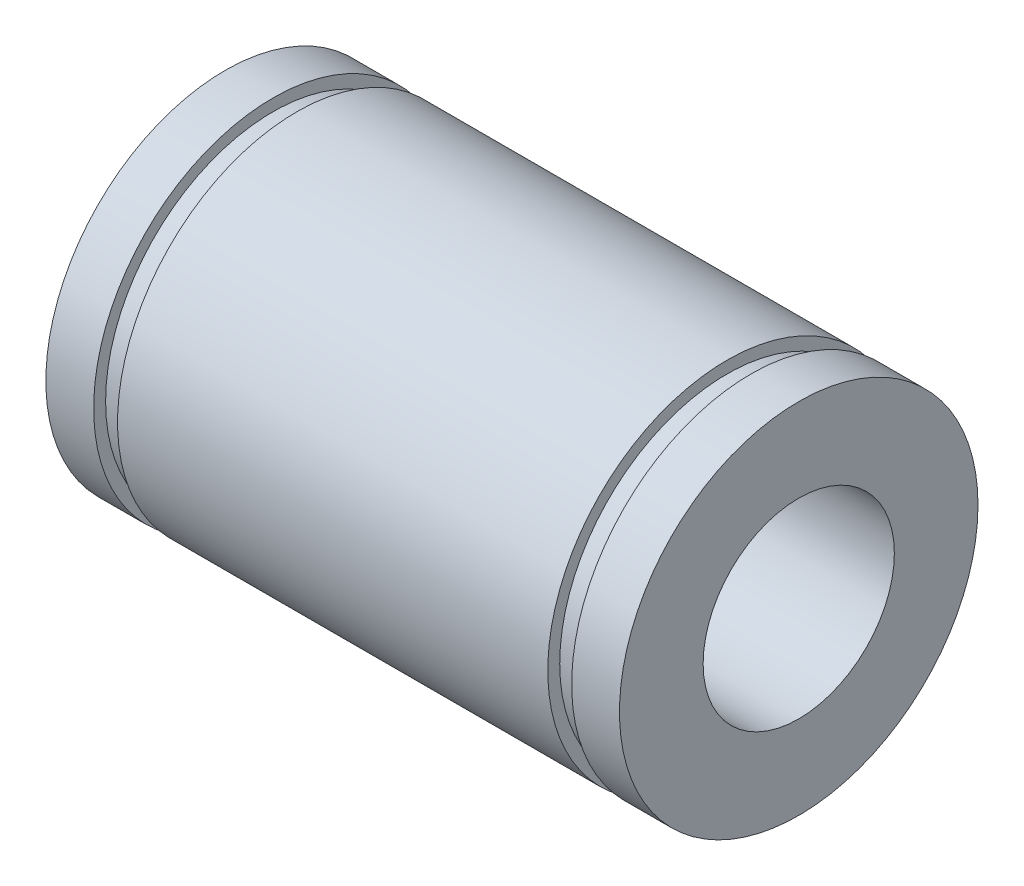
ISO-10303-21;
HEADER;
FILE_DESCRIPTION(('STEP AP214'),'2;1');
FILE_NAME('part.step','',(''),(''),'','','');
FILE_SCHEMA(('AUTOMOTIVE_DESIGN { 1 0 10303 214 1 1 1 1 }'));
ENDSEC;
DATA;
#1=APPLICATION_CONTEXT('core data for automotive mechanical design processes');
#2=APPLICATION_PROTOCOL_DEFINITION('international standard','automotive_design',2000,#1);
#3=PRODUCT_CONTEXT('',#1,'mechanical');
#4=PRODUCT('Part','Part','',(#3));
#5=PRODUCT_RELATED_PRODUCT_CATEGORY('part','',(#4));
#6=PRODUCT_DEFINITION_FORMATION('','',#4);
#7=PRODUCT_DEFINITION_CONTEXT('part definition',#1,'design');
#8=PRODUCT_DEFINITION('design','',#6,#7);
#9=PRODUCT_DEFINITION_SHAPE('','',#8);
#10=(LENGTH_UNIT() NAMED_UNIT(*) SI_UNIT(.MILLI.,.METRE.));
#11=(NAMED_UNIT(*) PLANE_ANGLE_UNIT() SI_UNIT($,.RADIAN.));
#12=(NAMED_UNIT(*) SI_UNIT($,.STERADIAN.) SOLID_ANGLE_UNIT());
#13=UNCERTAINTY_MEASURE_WITH_UNIT(LENGTH_MEASURE(1.E-05),#10,'distance_accuracy_value','');
#14=(GEOMETRIC_REPRESENTATION_CONTEXT(3) GLOBAL_UNCERTAINTY_ASSIGNED_CONTEXT((#13)) GLOBAL_UNIT_ASSIGNED_CONTEXT((#10,
#11,#12)) REPRESENTATION_CONTEXT('',''));
#15=CARTESIAN_POINT('',(0.,0.,0.));
#16=DIRECTION('',(0.,0.,1.));
#17=DIRECTION('',(1.,0.,0.));
#18=AXIS2_PLACEMENT_3D('',#15,#16,#17);
#19=CARTESIAN_POINT('',(21.,0.,0.));
#20=DIRECTION('',(1.,0.,0.));
#21=DIRECTION('',(0.,0.,-1.));
#22=AXIS2_PLACEMENT_3D('',#19,#20,#21);
#23=PLANE('',#22);
#24=CARTESIAN_POINT('',(21.,0.,0.));
#25=DIRECTION('',(1.,0.,0.));
#26=DIRECTION('',(0.,0.,-1.));
#27=AXIS2_PLACEMENT_3D('',#24,#25,#26);
#28=CIRCLE('',#27,7.5);
#29=CARTESIAN_POINT('',(21.,0.,-7.5));
#30=VERTEX_POINT('',#29);
#31=EDGE_CURVE('E50',#30,#30,#28,.T.);
#32=ORIENTED_EDGE('',*,*,#31,.T.);
#33=EDGE_LOOP('',(#32));
#34=FACE_BOUND('',#33,.T.);
#35=CARTESIAN_POINT('',(21.,0.,0.));
#36=DIRECTION('',(1.,0.,0.));
#37=DIRECTION('',(0.,0.,-1.));
#38=AXIS2_PLACEMENT_3D('',#35,#36,#37);
#39=CIRCLE('',#38,7.);
#40=CARTESIAN_POINT('',(21.,0.,-7.));
#41=VERTEX_POINT('',#40);
#42=EDGE_CURVE('E59',#41,#41,#39,.T.);
#43=ORIENTED_EDGE('',*,*,#42,.F.);
#44=EDGE_LOOP('',(#43));
#45=FACE_BOUND('',#44,.T.);
#46=ADVANCED_FACE('F31',(#34,#45),#23,.T.);
#47=CARTESIAN_POINT('',(2.,0.,0.));
#48=DIRECTION('',(1.,0.,0.));
#49=DIRECTION('',(0.,0.,-1.));
#50=AXIS2_PLACEMENT_3D('',#47,#48,#49);
#51=PLANE('',#50);
#52=CARTESIAN_POINT('',(2.,0.,0.));
#53=DIRECTION('',(1.,0.,0.));
#54=DIRECTION('',(0.,0.,-1.));
#55=AXIS2_PLACEMENT_3D('',#52,#53,#54);
#56=CIRCLE('',#55,7.5);
#57=CARTESIAN_POINT('',(2.,0.,-7.5));
#58=VERTEX_POINT('',#57);
#59=EDGE_CURVE('E10',#58,#58,#56,.T.);
#60=ORIENTED_EDGE('',*,*,#59,.T.);
#61=EDGE_LOOP('',(#60));
#62=FACE_BOUND('',#61,.T.);
#63=CARTESIAN_POINT('',(2.,0.,0.));
#64=DIRECTION('',(1.,0.,0.));
#65=DIRECTION('',(0.,0.,-1.));
#66=AXIS2_PLACEMENT_3D('',#63,#64,#65);
#67=CIRCLE('',#66,7.);
#68=CARTESIAN_POINT('',(2.,0.,-7.));
#69=VERTEX_POINT('',#68);
#70=EDGE_CURVE('E47',#69,#69,#67,.T.);
#71=ORIENTED_EDGE('',*,*,#70,.F.);
#72=EDGE_LOOP('',(#71));
#73=FACE_BOUND('',#72,.T.);
#74=ADVANCED_FACE('F92',(#62,#73),#51,.T.);
#75=CARTESIAN_POINT('',(0.,0.,0.));
#76=DIRECTION('',(1.,0.,0.));
#77=DIRECTION('',(0.,0.,-1.));
#78=AXIS2_PLACEMENT_3D('',#75,#76,#77);
#79=PLANE('',#78);
#80=CARTESIAN_POINT('',(0.,0.,0.));
#81=DIRECTION('',(1.,0.,0.));
#82=DIRECTION('',(0.,0.,-1.));
#83=AXIS2_PLACEMENT_3D('',#80,#81,#82);
#84=CIRCLE('',#83,7.5);
#85=CARTESIAN_POINT('',(0.,0.,-7.5));
#86=VERTEX_POINT('',#85);
#87=EDGE_CURVE('E35',#86,#86,#84,.T.);
#88=ORIENTED_EDGE('',*,*,#87,.F.);
#89=EDGE_LOOP('',(#88));
#90=FACE_BOUND('',#89,.T.);
#91=CARTESIAN_POINT('',(0.,0.,0.));
#92=DIRECTION('',(1.,0.,0.));
#93=DIRECTION('',(0.,0.,-1.));
#94=AXIS2_PLACEMENT_3D('',#91,#92,#93);
#95=CIRCLE('',#94,4.);
#96=CARTESIAN_POINT('',(0.,0.,-4.));
#97=VERTEX_POINT('',#96);
#98=EDGE_CURVE('E42',#97,#97,#95,.T.);
#99=ORIENTED_EDGE('',*,*,#98,.T.);
#100=EDGE_LOOP('',(#99));
#101=FACE_BOUND('',#100,.T.);
#102=ADVANCED_FACE('F98',(#90,#101),#79,.F.);
#103=CARTESIAN_POINT('',(2.,0.,0.));
#104=DIRECTION('',(-1.,0.,0.));
#105=DIRECTION('',(0.,0.,1.));
#106=AXIS2_PLACEMENT_3D('',#103,#104,#105);
#107=CYLINDRICAL_SURFACE('',#106,7.5);
#108=ORIENTED_EDGE('',*,*,#59,.F.);
#109=EDGE_LOOP('',(#108));
#110=FACE_BOUND('',#109,.T.);
#111=ORIENTED_EDGE('',*,*,#87,.T.);
#112=EDGE_LOOP('',(#111));
#113=FACE_BOUND('',#112,.T.);
#114=ADVANCED_FACE('F33',(#110,#113),#107,.T.);
#115=CARTESIAN_POINT('',(2.,0.,0.));
#116=DIRECTION('',(-1.,0.,0.));
#117=DIRECTION('',(0.,0.,1.));
#118=AXIS2_PLACEMENT_3D('',#115,#116,#117);
#119=CYLINDRICAL_SURFACE('',#118,4.);
#120=ORIENTED_EDGE('',*,*,#98,.F.);
#121=EDGE_LOOP('',(#120));
#122=FACE_BOUND('',#121,.T.);
#123=CARTESIAN_POINT('',(24.,0.,0.));
#124=DIRECTION('',(1.,0.,0.));
#125=DIRECTION('',(0.,0.,-1.));
#126=AXIS2_PLACEMENT_3D('',#123,#124,#125);
#127=CIRCLE('',#126,4.);
#128=CARTESIAN_POINT('',(24.,0.,-4.));
#129=VERTEX_POINT('',#128);
#130=EDGE_CURVE('E68',#129,#129,#127,.T.);
#131=ORIENTED_EDGE('',*,*,#130,.T.);
#132=EDGE_LOOP('',(#131));
#133=FACE_BOUND('',#132,.T.);
#134=ADVANCED_FACE('F74',(#122,#133),#119,.F.);
#135=CARTESIAN_POINT('',(3.,0.,0.));
#136=DIRECTION('',(-1.,0.,0.));
#137=DIRECTION('',(0.,0.,1.));
#138=AXIS2_PLACEMENT_3D('',#135,#136,#137);
#139=CYLINDRICAL_SURFACE('',#138,7.);
#140=CARTESIAN_POINT('',(3.,0.,0.));
#141=DIRECTION('',(1.,0.,0.));
#142=DIRECTION('',(0.,0.,-1.));
#143=AXIS2_PLACEMENT_3D('',#140,#141,#142);
#144=CIRCLE('',#143,7.);
#145=CARTESIAN_POINT('',(3.,0.,-7.));
#146=VERTEX_POINT('',#145);
#147=EDGE_CURVE('E46',#146,#146,#144,.T.);
#148=ORIENTED_EDGE('',*,*,#147,.F.);
#149=EDGE_LOOP('',(#148));
#150=FACE_BOUND('',#149,.T.);
#151=ORIENTED_EDGE('',*,*,#70,.T.);
#152=EDGE_LOOP('',(#151));
#153=FACE_BOUND('',#152,.T.);
#154=ADVANCED_FACE('F107',(#150,#153),#139,.T.);
#155=CARTESIAN_POINT('',(3.,0.,0.));
#156=DIRECTION('',(1.,0.,0.));
#157=DIRECTION('',(0.,0.,-1.));
#158=AXIS2_PLACEMENT_3D('',#155,#156,#157);
#159=PLANE('',#158);
#160=CARTESIAN_POINT('',(3.,0.,0.));
#161=DIRECTION('',(1.,0.,0.));
#162=DIRECTION('',(0.,0.,-1.));
#163=AXIS2_PLACEMENT_3D('',#160,#161,#162);
#164=CIRCLE('',#163,7.5);
#165=CARTESIAN_POINT('',(3.,0.,-7.5));
#166=VERTEX_POINT('',#165);
#167=EDGE_CURVE('E53',#166,#166,#164,.T.);
#168=ORIENTED_EDGE('',*,*,#167,.F.);
#169=EDGE_LOOP('',(#168));
#170=FACE_BOUND('',#169,.T.);
#171=ORIENTED_EDGE('',*,*,#147,.T.);
#172=EDGE_LOOP('',(#171));
#173=FACE_BOUND('',#172,.T.);
#174=ADVANCED_FACE('F103',(#170,#173),#159,.F.);
#175=CARTESIAN_POINT('',(21.,0.,0.));
#176=DIRECTION('',(-1.,0.,0.));
#177=DIRECTION('',(0.,0.,1.));
#178=AXIS2_PLACEMENT_3D('',#175,#176,#177);
#179=CYLINDRICAL_SURFACE('',#178,7.5);
#180=ORIENTED_EDGE('',*,*,#31,.F.);
#181=EDGE_LOOP('',(#180));
#182=FACE_BOUND('',#181,.T.);
#183=ORIENTED_EDGE('',*,*,#167,.T.);
#184=EDGE_LOOP('',(#183));
#185=FACE_BOUND('',#184,.T.);
#186=ADVANCED_FACE('F106',(#182,#185),#179,.T.);
#187=CARTESIAN_POINT('',(22.,0.,0.));
#188=DIRECTION('',(-1.,0.,0.));
#189=DIRECTION('',(0.,0.,1.));
#190=AXIS2_PLACEMENT_3D('',#187,#188,#189);
#191=CYLINDRICAL_SURFACE('',#190,7.);
#192=CARTESIAN_POINT('',(22.,0.,0.));
#193=DIRECTION('',(1.,0.,0.));
#194=DIRECTION('',(0.,0.,-1.));
#195=AXIS2_PLACEMENT_3D('',#192,#193,#194);
#196=CIRCLE('',#195,7.);
#197=CARTESIAN_POINT('',(22.,0.,-7.));
#198=VERTEX_POINT('',#197);
#199=EDGE_CURVE('E56',#198,#198,#196,.T.);
#200=ORIENTED_EDGE('',*,*,#199,.F.);
#201=EDGE_LOOP('',(#200));
#202=FACE_BOUND('',#201,.T.);
#203=ORIENTED_EDGE('',*,*,#42,.T.);
#204=EDGE_LOOP('',(#203));
#205=FACE_BOUND('',#204,.T.);
#206=ADVANCED_FACE('F88',(#202,#205),#191,.T.);
#207=CARTESIAN_POINT('',(22.,0.,0.));
#208=DIRECTION('',(1.,0.,0.));
#209=DIRECTION('',(0.,0.,-1.));
#210=AXIS2_PLACEMENT_3D('',#207,#208,#209);
#211=PLANE('',#210);
#212=CARTESIAN_POINT('',(22.,0.,0.));
#213=DIRECTION('',(1.,0.,0.));
#214=DIRECTION('',(0.,0.,-1.));
#215=AXIS2_PLACEMENT_3D('',#212,#213,#214);
#216=CIRCLE('',#215,7.5);
#217=CARTESIAN_POINT('',(22.,0.,-7.5));
#218=VERTEX_POINT('',#217);
#219=EDGE_CURVE('E65',#218,#218,#216,.T.);
#220=ORIENTED_EDGE('',*,*,#219,.F.);
#221=EDGE_LOOP('',(#220));
#222=FACE_BOUND('',#221,.T.);
#223=ORIENTED_EDGE('',*,*,#199,.T.);
#224=EDGE_LOOP('',(#223));
#225=FACE_BOUND('',#224,.T.);
#226=ADVANCED_FACE('F79',(#222,#225),#211,.F.);
#227=CARTESIAN_POINT('',(24.,0.,0.));
#228=DIRECTION('',(1.,0.,0.));
#229=DIRECTION('',(0.,0.,-1.));
#230=AXIS2_PLACEMENT_3D('',#227,#228,#229);
#231=PLANE('',#230);
#232=CARTESIAN_POINT('',(24.,0.,0.));
#233=DIRECTION('',(1.,0.,0.));
#234=DIRECTION('',(0.,0.,-1.));
#235=AXIS2_PLACEMENT_3D('',#232,#233,#234);
#236=CIRCLE('',#235,7.5);
#237=CARTESIAN_POINT('',(24.,0.,-7.5));
#238=VERTEX_POINT('',#237);
#239=EDGE_CURVE('E62',#238,#238,#236,.T.);
#240=ORIENTED_EDGE('',*,*,#239,.T.);
#241=EDGE_LOOP('',(#240));
#242=FACE_BOUND('',#241,.T.);
#243=ORIENTED_EDGE('',*,*,#130,.F.);
#244=EDGE_LOOP('',(#243));
#245=FACE_BOUND('',#244,.T.);
#246=ADVANCED_FACE('F76',(#242,#245),#231,.T.);
#247=CARTESIAN_POINT('',(24.,0.,0.));
#248=DIRECTION('',(-1.,0.,0.));
#249=DIRECTION('',(0.,0.,1.));
#250=AXIS2_PLACEMENT_3D('',#247,#248,#249);
#251=CYLINDRICAL_SURFACE('',#250,7.5);
#252=ORIENTED_EDGE('',*,*,#239,.F.);
#253=EDGE_LOOP('',(#252));
#254=FACE_BOUND('',#253,.T.);
#255=ORIENTED_EDGE('',*,*,#219,.T.);
#256=EDGE_LOOP('',(#255));
#257=FACE_BOUND('',#256,.T.);
#258=ADVANCED_FACE('F78',(#254,#257),#251,.T.);
#259=CLOSED_SHELL('',(#46,#74,#102,#114,#134,#154,#174,#186,#206,#226,#246,#258));
#260=MANIFOLD_SOLID_BREP('B2',#259);
#261=ADVANCED_BREP_SHAPE_REPRESENTATION('',(#18,#260),#14);
#262=SHAPE_DEFINITION_REPRESENTATION(#9,#261);
ENDSEC;
END-ISO-10303-21;
